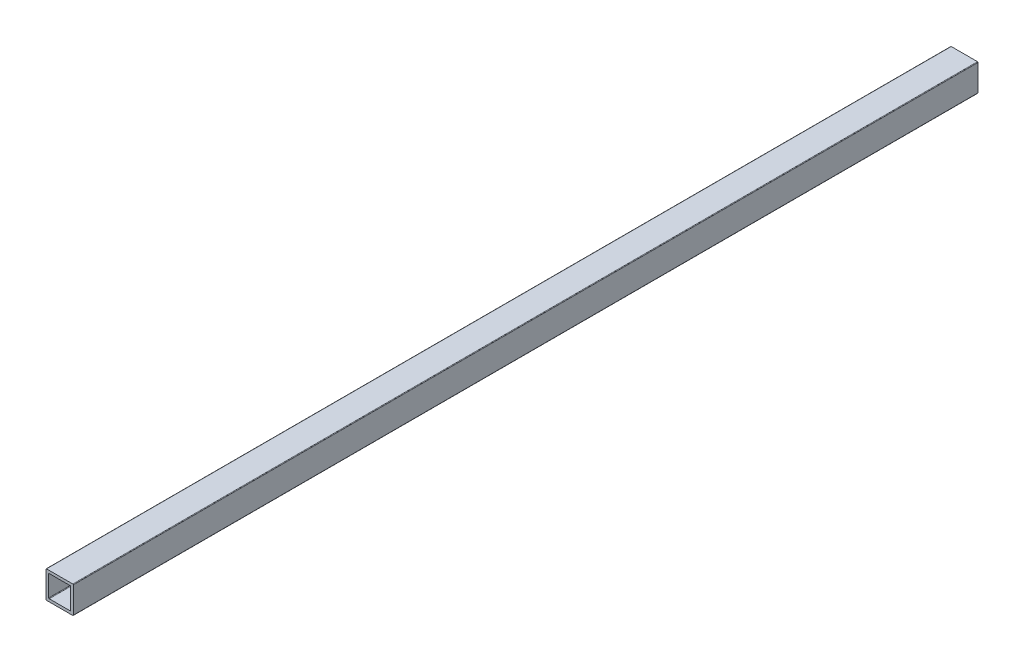
ISO-10303-21;
HEADER;
FILE_DESCRIPTION(('STEP AP214'),'2;1');
FILE_NAME('part.step','',(''),(''),'','','');
FILE_SCHEMA(('AUTOMOTIVE_DESIGN { 1 0 10303 214 1 1 1 1 }'));
ENDSEC;
DATA;
#1=APPLICATION_CONTEXT('core data for automotive mechanical design processes');
#2=APPLICATION_PROTOCOL_DEFINITION('international standard','automotive_design',2000,#1);
#3=PRODUCT_CONTEXT('',#1,'mechanical');
#4=PRODUCT('Part','Part','',(#3));
#5=PRODUCT_RELATED_PRODUCT_CATEGORY('part','',(#4));
#6=PRODUCT_DEFINITION_FORMATION('','',#4);
#7=PRODUCT_DEFINITION_CONTEXT('part definition',#1,'design');
#8=PRODUCT_DEFINITION('design','',#6,#7);
#9=PRODUCT_DEFINITION_SHAPE('','',#8);
#10=(LENGTH_UNIT() NAMED_UNIT(*) SI_UNIT(.MILLI.,.METRE.));
#11=(NAMED_UNIT(*) PLANE_ANGLE_UNIT() SI_UNIT($,.RADIAN.));
#12=(NAMED_UNIT(*) SI_UNIT($,.STERADIAN.) SOLID_ANGLE_UNIT());
#13=UNCERTAINTY_MEASURE_WITH_UNIT(LENGTH_MEASURE(1.E-05),#10,'distance_accuracy_value','');
#14=(GEOMETRIC_REPRESENTATION_CONTEXT(3) GLOBAL_UNCERTAINTY_ASSIGNED_CONTEXT((#13)) GLOBAL_UNIT_ASSIGNED_CONTEXT((#10,
#11,#12)) REPRESENTATION_CONTEXT('',''));
#15=CARTESIAN_POINT('',(0.,0.,0.));
#16=DIRECTION('',(0.,0.,1.));
#17=DIRECTION('',(1.,0.,0.));
#18=AXIS2_PLACEMENT_3D('',#15,#16,#17);
#19=CARTESIAN_POINT('',(0.,0.,331.47));
#20=DIRECTION('',(0.,0.,1.));
#21=DIRECTION('',(1.,0.,0.));
#22=AXIS2_PLACEMENT_3D('',#19,#20,#21);
#23=PLANE('',#22);
#24=DIRECTION('',(0.,-1.,0.));
#25=VECTOR('',#24,1.);
#26=CARTESIAN_POINT('',(-5.,5.,331.47));
#27=LINE('',#26,#25);
#28=CARTESIAN_POINT('',(-5.,4.8,331.47));
#29=VERTEX_POINT('',#28);
#30=CARTESIAN_POINT('',(-5.,-4.8,331.47));
#31=VERTEX_POINT('',#30);
#32=EDGE_CURVE('E262',#29,#31,#27,.T.);
#33=ORIENTED_EDGE('',*,*,#32,.T.);
#34=CARTESIAN_POINT('',(-4.8,-4.8,331.47));
#35=DIRECTION('',(0.,0.,1.));
#36=DIRECTION('',(1.,0.,0.));
#37=AXIS2_PLACEMENT_3D('',#34,#35,#36);
#38=CIRCLE('',#37,0.2);
#39=CARTESIAN_POINT('',(-4.8,-5.,331.47));
#40=VERTEX_POINT('',#39);
#41=EDGE_CURVE('E212',#31,#40,#38,.T.);
#42=ORIENTED_EDGE('',*,*,#41,.T.);
#43=DIRECTION('',(1.,0.,0.));
#44=VECTOR('',#43,1.);
#45=CARTESIAN_POINT('',(-5.,-5.,331.47));
#46=LINE('',#45,#44);
#47=CARTESIAN_POINT('',(4.8,-5.,331.47));
#48=VERTEX_POINT('',#47);
#49=EDGE_CURVE('E265',#40,#48,#46,.T.);
#50=ORIENTED_EDGE('',*,*,#49,.T.);
#51=CARTESIAN_POINT('',(4.8,-4.8,331.47));
#52=DIRECTION('',(0.,0.,1.));
#53=DIRECTION('',(1.,0.,0.));
#54=AXIS2_PLACEMENT_3D('',#51,#52,#53);
#55=CIRCLE('',#54,0.2);
#56=CARTESIAN_POINT('',(5.,-4.8,331.47));
#57=VERTEX_POINT('',#56);
#58=EDGE_CURVE('E210',#48,#57,#55,.T.);
#59=ORIENTED_EDGE('',*,*,#58,.T.);
#60=DIRECTION('',(0.,1.,0.));
#61=VECTOR('',#60,1.);
#62=CARTESIAN_POINT('',(5.,5.,331.47));
#63=LINE('',#62,#61);
#64=CARTESIAN_POINT('',(5.,4.8,331.47));
#65=VERTEX_POINT('',#64);
#66=EDGE_CURVE('E173',#57,#65,#63,.T.);
#67=ORIENTED_EDGE('',*,*,#66,.T.);
#68=CARTESIAN_POINT('',(4.8,4.8,331.47));
#69=DIRECTION('',(0.,0.,1.));
#70=DIRECTION('',(1.,0.,0.));
#71=AXIS2_PLACEMENT_3D('',#68,#69,#70);
#72=CIRCLE('',#71,0.2);
#73=CARTESIAN_POINT('',(4.8,5.,331.47));
#74=VERTEX_POINT('',#73);
#75=EDGE_CURVE('E206',#65,#74,#72,.T.);
#76=ORIENTED_EDGE('',*,*,#75,.T.);
#77=DIRECTION('',(-1.,0.,0.));
#78=VECTOR('',#77,1.);
#79=CARTESIAN_POINT('',(-5.,5.,331.47));
#80=LINE('',#79,#78);
#81=CARTESIAN_POINT('',(-4.8,5.,331.47));
#82=VERTEX_POINT('',#81);
#83=EDGE_CURVE('E168',#74,#82,#80,.T.);
#84=ORIENTED_EDGE('',*,*,#83,.T.);
#85=CARTESIAN_POINT('',(-4.8,4.8,331.47));
#86=DIRECTION('',(0.,0.,1.));
#87=DIRECTION('',(1.,0.,0.));
#88=AXIS2_PLACEMENT_3D('',#85,#86,#87);
#89=CIRCLE('',#88,0.2);
#90=EDGE_CURVE('E208',#82,#29,#89,.T.);
#91=ORIENTED_EDGE('',*,*,#90,.T.);
#92=EDGE_LOOP('',(#33,#42,#50,#59,#67,#76,#84,#91));
#93=FACE_BOUND('',#92,.T.);
#94=DIRECTION('',(1.,0.,0.));
#95=VECTOR('',#94,1.);
#96=CARTESIAN_POINT('',(-4.,-4.,331.47));
#97=LINE('',#96,#95);
#98=CARTESIAN_POINT('',(-3.8,-4.,331.47));
#99=VERTEX_POINT('',#98);
#100=CARTESIAN_POINT('',(3.8,-4.,331.47));
#101=VERTEX_POINT('',#100);
#102=EDGE_CURVE('E247',#99,#101,#97,.T.);
#103=ORIENTED_EDGE('',*,*,#102,.F.);
#104=CARTESIAN_POINT('',(-3.8,-3.8,331.47));
#105=DIRECTION('',(0.,0.,1.));
#106=DIRECTION('',(1.,0.,0.));
#107=AXIS2_PLACEMENT_3D('',#104,#105,#106);
#108=CIRCLE('',#107,0.2);
#109=CARTESIAN_POINT('',(-4.,-3.8,331.47));
#110=VERTEX_POINT('',#109);
#111=EDGE_CURVE('E11',#99,#110,#108,.F.);
#112=ORIENTED_EDGE('',*,*,#111,.T.);
#113=DIRECTION('',(0.,-1.,0.));
#114=VECTOR('',#113,1.);
#115=CARTESIAN_POINT('',(-4.,4.,331.47));
#116=LINE('',#115,#114);
#117=CARTESIAN_POINT('',(-4.,3.8,331.47));
#118=VERTEX_POINT('',#117);
#119=EDGE_CURVE('E245',#118,#110,#116,.T.);
#120=ORIENTED_EDGE('',*,*,#119,.F.);
#121=CARTESIAN_POINT('',(-3.8,3.8,331.47));
#122=DIRECTION('',(0.,0.,1.));
#123=DIRECTION('',(1.,0.,0.));
#124=AXIS2_PLACEMENT_3D('',#121,#122,#123);
#125=CIRCLE('',#124,0.2);
#126=CARTESIAN_POINT('',(-3.8,4.,331.47));
#127=VERTEX_POINT('',#126);
#128=EDGE_CURVE('E156',#118,#127,#125,.F.);
#129=ORIENTED_EDGE('',*,*,#128,.T.);
#130=DIRECTION('',(-1.,0.,0.));
#131=VECTOR('',#130,1.);
#132=CARTESIAN_POINT('',(-4.,4.,331.47));
#133=LINE('',#132,#131);
#134=CARTESIAN_POINT('',(3.8,4.,331.47));
#135=VERTEX_POINT('',#134);
#136=EDGE_CURVE('E257',#135,#127,#133,.T.);
#137=ORIENTED_EDGE('',*,*,#136,.F.);
#138=CARTESIAN_POINT('',(3.8,3.8,331.47));
#139=DIRECTION('',(0.,0.,1.));
#140=DIRECTION('',(1.,0.,0.));
#141=AXIS2_PLACEMENT_3D('',#138,#139,#140);
#142=CIRCLE('',#141,0.2);
#143=CARTESIAN_POINT('',(4.,3.8,331.47));
#144=VERTEX_POINT('',#143);
#145=EDGE_CURVE('E229',#135,#144,#142,.F.);
#146=ORIENTED_EDGE('',*,*,#145,.T.);
#147=DIRECTION('',(0.,1.,0.));
#148=VECTOR('',#147,1.);
#149=CARTESIAN_POINT('',(4.,4.,331.47));
#150=LINE('',#149,#148);
#151=CARTESIAN_POINT('',(4.,-3.8,331.47));
#152=VERTEX_POINT('',#151);
#153=EDGE_CURVE('E252',#152,#144,#150,.T.);
#154=ORIENTED_EDGE('',*,*,#153,.F.);
#155=CARTESIAN_POINT('',(3.8,-3.8,331.47));
#156=DIRECTION('',(0.,0.,1.));
#157=DIRECTION('',(1.,0.,0.));
#158=AXIS2_PLACEMENT_3D('',#155,#156,#157);
#159=CIRCLE('',#158,0.2);
#160=EDGE_CURVE('E47',#152,#101,#159,.F.);
#161=ORIENTED_EDGE('',*,*,#160,.T.);
#162=EDGE_LOOP('',(#103,#112,#120,#129,#137,#146,#154,#161));
#163=FACE_BOUND('',#162,.T.);
#164=ADVANCED_FACE('F32',(#93,#163),#23,.T.);
#165=CARTESIAN_POINT('',(0.,0.,0.));
#166=DIRECTION('',(0.,0.,1.));
#167=DIRECTION('',(1.,0.,0.));
#168=AXIS2_PLACEMENT_3D('',#165,#166,#167);
#169=PLANE('',#168);
#170=DIRECTION('',(1.,0.,0.));
#171=VECTOR('',#170,1.);
#172=CARTESIAN_POINT('',(-5.,-5.,0.));
#173=LINE('',#172,#171);
#174=CARTESIAN_POINT('',(-4.8,-5.,0.));
#175=VERTEX_POINT('',#174);
#176=CARTESIAN_POINT('',(4.8,-5.,0.));
#177=VERTEX_POINT('',#176);
#178=EDGE_CURVE('E272',#175,#177,#173,.T.);
#179=ORIENTED_EDGE('',*,*,#178,.F.);
#180=CARTESIAN_POINT('',(-4.8,-4.8,0.));
#181=DIRECTION('',(0.,0.,1.));
#182=DIRECTION('',(1.,0.,0.));
#183=AXIS2_PLACEMENT_3D('',#180,#181,#182);
#184=CIRCLE('',#183,0.2);
#185=CARTESIAN_POINT('',(-5.,-4.8,0.));
#186=VERTEX_POINT('',#185);
#187=EDGE_CURVE('E199',#175,#186,#184,.F.);
#188=ORIENTED_EDGE('',*,*,#187,.T.);
#189=DIRECTION('',(0.,-1.,0.));
#190=VECTOR('',#189,1.);
#191=CARTESIAN_POINT('',(-5.,5.,0.));
#192=LINE('',#191,#190);
#193=CARTESIAN_POINT('',(-5.,4.8,0.));
#194=VERTEX_POINT('',#193);
#195=EDGE_CURVE('E260',#194,#186,#192,.T.);
#196=ORIENTED_EDGE('',*,*,#195,.F.);
#197=CARTESIAN_POINT('',(-4.8,4.8,0.));
#198=DIRECTION('',(0.,0.,1.));
#199=DIRECTION('',(1.,0.,0.));
#200=AXIS2_PLACEMENT_3D('',#197,#198,#199);
#201=CIRCLE('',#200,0.2);
#202=CARTESIAN_POINT('',(-4.8,5.,0.));
#203=VERTEX_POINT('',#202);
#204=EDGE_CURVE('E195',#194,#203,#201,.F.);
#205=ORIENTED_EDGE('',*,*,#204,.T.);
#206=DIRECTION('',(-1.,0.,0.));
#207=VECTOR('',#206,1.);
#208=CARTESIAN_POINT('',(-5.,5.,0.));
#209=LINE('',#208,#207);
#210=CARTESIAN_POINT('',(4.8,5.,0.));
#211=VERTEX_POINT('',#210);
#212=EDGE_CURVE('E176',#211,#203,#209,.T.);
#213=ORIENTED_EDGE('',*,*,#212,.F.);
#214=CARTESIAN_POINT('',(4.8,4.8,0.));
#215=DIRECTION('',(0.,0.,1.));
#216=DIRECTION('',(1.,0.,0.));
#217=AXIS2_PLACEMENT_3D('',#214,#215,#216);
#218=CIRCLE('',#217,0.2);
#219=CARTESIAN_POINT('',(5.,4.8,0.));
#220=VERTEX_POINT('',#219);
#221=EDGE_CURVE('E193',#211,#220,#218,.F.);
#222=ORIENTED_EDGE('',*,*,#221,.T.);
#223=DIRECTION('',(0.,1.,0.));
#224=VECTOR('',#223,1.);
#225=CARTESIAN_POINT('',(5.,5.,0.));
#226=LINE('',#225,#224);
#227=CARTESIAN_POINT('',(5.,-4.8,0.));
#228=VERTEX_POINT('',#227);
#229=EDGE_CURVE('E274',#228,#220,#226,.T.);
#230=ORIENTED_EDGE('',*,*,#229,.F.);
#231=CARTESIAN_POINT('',(4.8,-4.8,0.));
#232=DIRECTION('',(0.,0.,1.));
#233=DIRECTION('',(1.,0.,0.));
#234=AXIS2_PLACEMENT_3D('',#231,#232,#233);
#235=CIRCLE('',#234,0.2);
#236=EDGE_CURVE('E197',#228,#177,#235,.F.);
#237=ORIENTED_EDGE('',*,*,#236,.T.);
#238=EDGE_LOOP('',(#179,#188,#196,#205,#213,#222,#230,#237));
#239=FACE_BOUND('',#238,.T.);
#240=DIRECTION('',(-1.,0.,0.));
#241=VECTOR('',#240,1.);
#242=CARTESIAN_POINT('',(-4.,4.,0.));
#243=LINE('',#242,#241);
#244=CARTESIAN_POINT('',(3.8,4.,0.));
#245=VERTEX_POINT('',#244);
#246=CARTESIAN_POINT('',(-3.8,4.,0.));
#247=VERTEX_POINT('',#246);
#248=EDGE_CURVE('E165',#245,#247,#243,.T.);
#249=ORIENTED_EDGE('',*,*,#248,.T.);
#250=CARTESIAN_POINT('',(-3.8,3.8,0.));
#251=DIRECTION('',(0.,0.,1.));
#252=DIRECTION('',(1.,0.,0.));
#253=AXIS2_PLACEMENT_3D('',#250,#251,#252);
#254=CIRCLE('',#253,0.2);
#255=CARTESIAN_POINT('',(-4.,3.8,0.));
#256=VERTEX_POINT('',#255);
#257=EDGE_CURVE('E231',#247,#256,#254,.T.);
#258=ORIENTED_EDGE('',*,*,#257,.T.);
#259=DIRECTION('',(0.,-1.,0.));
#260=VECTOR('',#259,1.);
#261=CARTESIAN_POINT('',(-4.,4.,0.));
#262=LINE('',#261,#260);
#263=CARTESIAN_POINT('',(-4.,-3.8,0.));
#264=VERTEX_POINT('',#263);
#265=EDGE_CURVE('E236',#256,#264,#262,.T.);
#266=ORIENTED_EDGE('',*,*,#265,.T.);
#267=CARTESIAN_POINT('',(-3.8,-3.8,0.));
#268=DIRECTION('',(0.,0.,1.));
#269=DIRECTION('',(1.,0.,0.));
#270=AXIS2_PLACEMENT_3D('',#267,#268,#269);
#271=CIRCLE('',#270,0.2);
#272=CARTESIAN_POINT('',(-3.8,-4.,0.));
#273=VERTEX_POINT('',#272);
#274=EDGE_CURVE('E40',#264,#273,#271,.T.);
#275=ORIENTED_EDGE('',*,*,#274,.T.);
#276=DIRECTION('',(1.,0.,0.));
#277=VECTOR('',#276,1.);
#278=CARTESIAN_POINT('',(-4.,-4.,0.));
#279=LINE('',#278,#277);
#280=CARTESIAN_POINT('',(3.8,-4.,0.));
#281=VERTEX_POINT('',#280);
#282=EDGE_CURVE('E151',#273,#281,#279,.T.);
#283=ORIENTED_EDGE('',*,*,#282,.T.);
#284=CARTESIAN_POINT('',(3.8,-3.8,0.));
#285=DIRECTION('',(0.,0.,1.));
#286=DIRECTION('',(1.,0.,0.));
#287=AXIS2_PLACEMENT_3D('',#284,#285,#286);
#288=CIRCLE('',#287,0.2);
#289=CARTESIAN_POINT('',(4.,-3.8,0.));
#290=VERTEX_POINT('',#289);
#291=EDGE_CURVE('E146',#281,#290,#288,.T.);
#292=ORIENTED_EDGE('',*,*,#291,.T.);
#293=DIRECTION('',(0.,1.,0.));
#294=VECTOR('',#293,1.);
#295=CARTESIAN_POINT('',(4.,4.,0.));
#296=LINE('',#295,#294);
#297=CARTESIAN_POINT('',(4.,3.8,0.));
#298=VERTEX_POINT('',#297);
#299=EDGE_CURVE('E150',#290,#298,#296,.T.);
#300=ORIENTED_EDGE('',*,*,#299,.T.);
#301=CARTESIAN_POINT('',(3.8,3.8,0.));
#302=DIRECTION('',(0.,0.,1.));
#303=DIRECTION('',(1.,0.,0.));
#304=AXIS2_PLACEMENT_3D('',#301,#302,#303);
#305=CIRCLE('',#304,0.2);
#306=EDGE_CURVE('E227',#298,#245,#305,.T.);
#307=ORIENTED_EDGE('',*,*,#306,.T.);
#308=EDGE_LOOP('',(#249,#258,#266,#275,#283,#292,#300,#307));
#309=FACE_BOUND('',#308,.T.);
#310=ADVANCED_FACE('F149',(#239,#309),#169,.F.);
#311=CARTESIAN_POINT('',(-5.,5.,331.47));
#312=DIRECTION('',(1.,0.,0.));
#313=DIRECTION('',(0.,1.,0.));
#314=AXIS2_PLACEMENT_3D('',#311,#312,#313);
#315=PLANE('',#314);
#316=ORIENTED_EDGE('',*,*,#195,.T.);
#317=DIRECTION('',(0.,0.,-1.));
#318=VECTOR('',#317,1.);
#319=CARTESIAN_POINT('',(-5.,-4.8,331.47));
#320=LINE('',#319,#318);
#321=EDGE_CURVE('E204',#186,#31,#320,.F.);
#322=ORIENTED_EDGE('',*,*,#321,.T.);
#323=ORIENTED_EDGE('',*,*,#32,.F.);
#324=DIRECTION('',(0.,0.,-1.));
#325=VECTOR('',#324,1.);
#326=CARTESIAN_POINT('',(-5.,4.8,331.47));
#327=LINE('',#326,#325);
#328=EDGE_CURVE('E201',#29,#194,#327,.T.);
#329=ORIENTED_EDGE('',*,*,#328,.T.);
#330=EDGE_LOOP('',(#316,#322,#323,#329));
#331=FACE_BOUND('',#330,.T.);
#332=ADVANCED_FACE('F295',(#331),#315,.F.);
#333=CARTESIAN_POINT('',(-5.,-5.,331.47));
#334=DIRECTION('',(0.,1.,0.));
#335=DIRECTION('',(-1.,0.,0.));
#336=AXIS2_PLACEMENT_3D('',#333,#334,#335);
#337=PLANE('',#336);
#338=ORIENTED_EDGE('',*,*,#49,.F.);
#339=DIRECTION('',(0.,0.,-1.));
#340=VECTOR('',#339,1.);
#341=CARTESIAN_POINT('',(-4.8,-5.,331.47));
#342=LINE('',#341,#340);
#343=EDGE_CURVE('E190',#40,#175,#342,.T.);
#344=ORIENTED_EDGE('',*,*,#343,.T.);
#345=ORIENTED_EDGE('',*,*,#178,.T.);
#346=DIRECTION('',(0.,0.,-1.));
#347=VECTOR('',#346,1.);
#348=CARTESIAN_POINT('',(4.8,-5.,331.47));
#349=LINE('',#348,#347);
#350=EDGE_CURVE('E188',#177,#48,#349,.F.);
#351=ORIENTED_EDGE('',*,*,#350,.T.);
#352=EDGE_LOOP('',(#338,#344,#345,#351));
#353=FACE_BOUND('',#352,.T.);
#354=ADVANCED_FACE('F304',(#353),#337,.F.);
#355=CARTESIAN_POINT('',(5.,5.,331.47));
#356=DIRECTION('',(-1.,0.,0.));
#357=DIRECTION('',(0.,-1.,0.));
#358=AXIS2_PLACEMENT_3D('',#355,#356,#357);
#359=PLANE('',#358);
#360=ORIENTED_EDGE('',*,*,#66,.F.);
#361=DIRECTION('',(0.,0.,-1.));
#362=VECTOR('',#361,1.);
#363=CARTESIAN_POINT('',(5.,-4.8,331.47));
#364=LINE('',#363,#362);
#365=EDGE_CURVE('E219',#57,#228,#364,.T.);
#366=ORIENTED_EDGE('',*,*,#365,.T.);
#367=ORIENTED_EDGE('',*,*,#229,.T.);
#368=DIRECTION('',(0.,0.,-1.));
#369=VECTOR('',#368,1.);
#370=CARTESIAN_POINT('',(5.,4.8,331.47));
#371=LINE('',#370,#369);
#372=EDGE_CURVE('E217',#220,#65,#371,.F.);
#373=ORIENTED_EDGE('',*,*,#372,.T.);
#374=EDGE_LOOP('',(#360,#366,#367,#373));
#375=FACE_BOUND('',#374,.T.);
#376=ADVANCED_FACE('F312',(#375),#359,.F.);
#377=CARTESIAN_POINT('',(-5.,5.,331.47));
#378=DIRECTION('',(0.,-1.,0.));
#379=DIRECTION('',(1.,0.,0.));
#380=AXIS2_PLACEMENT_3D('',#377,#378,#379);
#381=PLANE('',#380);
#382=ORIENTED_EDGE('',*,*,#212,.T.);
#383=DIRECTION('',(0.,0.,-1.));
#384=VECTOR('',#383,1.);
#385=CARTESIAN_POINT('',(-4.8,5.,331.47));
#386=LINE('',#385,#384);
#387=EDGE_CURVE('E225',#203,#82,#386,.F.);
#388=ORIENTED_EDGE('',*,*,#387,.T.);
#389=ORIENTED_EDGE('',*,*,#83,.F.);
#390=DIRECTION('',(0.,0.,-1.));
#391=VECTOR('',#390,1.);
#392=CARTESIAN_POINT('',(4.8,5.,331.47));
#393=LINE('',#392,#391);
#394=EDGE_CURVE('E222',#74,#211,#393,.T.);
#395=ORIENTED_EDGE('',*,*,#394,.T.);
#396=EDGE_LOOP('',(#382,#388,#389,#395));
#397=FACE_BOUND('',#396,.T.);
#398=ADVANCED_FACE('F283',(#397),#381,.F.);
#399=CARTESIAN_POINT('',(-4.,4.,331.47));
#400=DIRECTION('',(1.,0.,0.));
#401=DIRECTION('',(0.,1.,0.));
#402=AXIS2_PLACEMENT_3D('',#399,#400,#401);
#403=PLANE('',#402);
#404=ORIENTED_EDGE('',*,*,#265,.F.);
#405=DIRECTION('',(0.,0.,-1.));
#406=VECTOR('',#405,1.);
#407=CARTESIAN_POINT('',(-4.,3.8,331.47));
#408=LINE('',#407,#406);
#409=EDGE_CURVE('E186',#256,#118,#408,.F.);
#410=ORIENTED_EDGE('',*,*,#409,.T.);
#411=ORIENTED_EDGE('',*,*,#119,.T.);
#412=DIRECTION('',(0.,0.,-1.));
#413=VECTOR('',#412,1.);
#414=CARTESIAN_POINT('',(-4.,-3.8,0.));
#415=LINE('',#414,#413);
#416=EDGE_CURVE('E183',#110,#264,#415,.T.);
#417=ORIENTED_EDGE('',*,*,#416,.T.);
#418=EDGE_LOOP('',(#404,#410,#411,#417));
#419=FACE_BOUND('',#418,.T.);
#420=ADVANCED_FACE('F249',(#419),#403,.T.);
#421=CARTESIAN_POINT('',(-4.,-4.,331.47));
#422=DIRECTION('',(0.,1.,0.));
#423=DIRECTION('',(0.,0.,1.));
#424=AXIS2_PLACEMENT_3D('',#421,#422,#423);
#425=PLANE('',#424);
#426=ORIENTED_EDGE('',*,*,#102,.T.);
#427=DIRECTION('',(0.,0.,-1.));
#428=VECTOR('',#427,1.);
#429=CARTESIAN_POINT('',(3.8,-4.,0.));
#430=LINE('',#429,#428);
#431=EDGE_CURVE('E215',#101,#281,#430,.T.);
#432=ORIENTED_EDGE('',*,*,#431,.T.);
#433=ORIENTED_EDGE('',*,*,#282,.F.);
#434=DIRECTION('',(0.,0.,-1.));
#435=VECTOR('',#434,1.);
#436=CARTESIAN_POINT('',(-3.8,-4.,331.47));
#437=LINE('',#436,#435);
#438=EDGE_CURVE('E54',#273,#99,#437,.F.);
#439=ORIENTED_EDGE('',*,*,#438,.T.);
#440=EDGE_LOOP('',(#426,#432,#433,#439));
#441=FACE_BOUND('',#440,.T.);
#442=ADVANCED_FACE('F239',(#441),#425,.T.);
#443=CARTESIAN_POINT('',(4.,4.,331.47));
#444=DIRECTION('',(-1.,0.,0.));
#445=DIRECTION('',(0.,-1.,0.));
#446=AXIS2_PLACEMENT_3D('',#443,#444,#445);
#447=PLANE('',#446);
#448=ORIENTED_EDGE('',*,*,#153,.T.);
#449=DIRECTION('',(0.,0.,-1.));
#450=VECTOR('',#449,1.);
#451=CARTESIAN_POINT('',(4.,3.8,0.));
#452=LINE('',#451,#450);
#453=EDGE_CURVE('E164',#144,#298,#452,.T.);
#454=ORIENTED_EDGE('',*,*,#453,.T.);
#455=ORIENTED_EDGE('',*,*,#299,.F.);
#456=DIRECTION('',(0.,0.,-1.));
#457=VECTOR('',#456,1.);
#458=CARTESIAN_POINT('',(4.,-3.8,331.47));
#459=LINE('',#458,#457);
#460=EDGE_CURVE('E162',#290,#152,#459,.F.);
#461=ORIENTED_EDGE('',*,*,#460,.T.);
#462=EDGE_LOOP('',(#448,#454,#455,#461));
#463=FACE_BOUND('',#462,.T.);
#464=ADVANCED_FACE('F161',(#463),#447,.T.);
#465=CARTESIAN_POINT('',(-4.,4.,331.47));
#466=DIRECTION('',(0.,-1.,0.));
#467=DIRECTION('',(0.,0.,-1.));
#468=AXIS2_PLACEMENT_3D('',#465,#466,#467);
#469=PLANE('',#468);
#470=ORIENTED_EDGE('',*,*,#248,.F.);
#471=DIRECTION('',(0.,0.,-1.));
#472=VECTOR('',#471,1.);
#473=CARTESIAN_POINT('',(3.8,4.,331.47));
#474=LINE('',#473,#472);
#475=EDGE_CURVE('E181',#245,#135,#474,.F.);
#476=ORIENTED_EDGE('',*,*,#475,.T.);
#477=ORIENTED_EDGE('',*,*,#136,.T.);
#478=DIRECTION('',(0.,0.,-1.));
#479=VECTOR('',#478,1.);
#480=CARTESIAN_POINT('',(-3.8,4.,0.));
#481=LINE('',#480,#479);
#482=EDGE_CURVE('E170',#127,#247,#481,.T.);
#483=ORIENTED_EDGE('',*,*,#482,.T.);
#484=EDGE_LOOP('',(#470,#476,#477,#483));
#485=FACE_BOUND('',#484,.T.);
#486=ADVANCED_FACE('F334',(#485),#469,.T.);
#487=CARTESIAN_POINT('',(3.8,3.8,331.47));
#488=DIRECTION('',(0.,0.,1.));
#489=DIRECTION('',(1.,0.,0.));
#490=AXIS2_PLACEMENT_3D('',#487,#488,#489);
#491=CYLINDRICAL_SURFACE('',#490,0.2);
#492=ORIENTED_EDGE('',*,*,#145,.F.);
#493=ORIENTED_EDGE('',*,*,#475,.F.);
#494=ORIENTED_EDGE('',*,*,#306,.F.);
#495=ORIENTED_EDGE('',*,*,#453,.F.);
#496=EDGE_LOOP('',(#492,#493,#494,#495));
#497=FACE_BOUND('',#496,.T.);
#498=ADVANCED_FACE('F330',(#497),#491,.F.);
#499=CARTESIAN_POINT('',(-3.8,3.8,331.47));
#500=DIRECTION('',(0.,0.,1.));
#501=DIRECTION('',(1.,0.,0.));
#502=AXIS2_PLACEMENT_3D('',#499,#500,#501);
#503=CYLINDRICAL_SURFACE('',#502,0.2);
#504=ORIENTED_EDGE('',*,*,#128,.F.);
#505=ORIENTED_EDGE('',*,*,#409,.F.);
#506=ORIENTED_EDGE('',*,*,#257,.F.);
#507=ORIENTED_EDGE('',*,*,#482,.F.);
#508=EDGE_LOOP('',(#504,#505,#506,#507));
#509=FACE_BOUND('',#508,.T.);
#510=ADVANCED_FACE('F333',(#509),#503,.F.);
#511=CARTESIAN_POINT('',(-4.8,-4.8,331.47));
#512=DIRECTION('',(0.,0.,-1.));
#513=DIRECTION('',(-1.,0.,0.));
#514=AXIS2_PLACEMENT_3D('',#511,#512,#513);
#515=CYLINDRICAL_SURFACE('',#514,0.2);
#516=ORIENTED_EDGE('',*,*,#41,.F.);
#517=ORIENTED_EDGE('',*,*,#321,.F.);
#518=ORIENTED_EDGE('',*,*,#187,.F.);
#519=ORIENTED_EDGE('',*,*,#343,.F.);
#520=EDGE_LOOP('',(#516,#517,#518,#519));
#521=FACE_BOUND('',#520,.T.);
#522=ADVANCED_FACE('F299',(#521),#515,.T.);
#523=CARTESIAN_POINT('',(3.8,-3.8,331.47));
#524=DIRECTION('',(0.,0.,1.));
#525=DIRECTION('',(1.,0.,0.));
#526=AXIS2_PLACEMENT_3D('',#523,#524,#525);
#527=CYLINDRICAL_SURFACE('',#526,0.2);
#528=ORIENTED_EDGE('',*,*,#160,.F.);
#529=ORIENTED_EDGE('',*,*,#460,.F.);
#530=ORIENTED_EDGE('',*,*,#291,.F.);
#531=ORIENTED_EDGE('',*,*,#431,.F.);
#532=EDGE_LOOP('',(#528,#529,#530,#531));
#533=FACE_BOUND('',#532,.T.);
#534=ADVANCED_FACE('F167',(#533),#527,.F.);
#535=CARTESIAN_POINT('',(4.8,-4.8,331.47));
#536=DIRECTION('',(0.,0.,-1.));
#537=DIRECTION('',(-1.,0.,0.));
#538=AXIS2_PLACEMENT_3D('',#535,#536,#537);
#539=CYLINDRICAL_SURFACE('',#538,0.2);
#540=ORIENTED_EDGE('',*,*,#58,.F.);
#541=ORIENTED_EDGE('',*,*,#350,.F.);
#542=ORIENTED_EDGE('',*,*,#236,.F.);
#543=ORIENTED_EDGE('',*,*,#365,.F.);
#544=EDGE_LOOP('',(#540,#541,#542,#543));
#545=FACE_BOUND('',#544,.T.);
#546=ADVANCED_FACE('F308',(#545),#539,.T.);
#547=CARTESIAN_POINT('',(-4.8,4.8,331.47));
#548=DIRECTION('',(0.,0.,-1.));
#549=DIRECTION('',(-1.,0.,0.));
#550=AXIS2_PLACEMENT_3D('',#547,#548,#549);
#551=CYLINDRICAL_SURFACE('',#550,0.2);
#552=ORIENTED_EDGE('',*,*,#90,.F.);
#553=ORIENTED_EDGE('',*,*,#387,.F.);
#554=ORIENTED_EDGE('',*,*,#204,.F.);
#555=ORIENTED_EDGE('',*,*,#328,.F.);
#556=EDGE_LOOP('',(#552,#553,#554,#555));
#557=FACE_BOUND('',#556,.T.);
#558=ADVANCED_FACE('F289',(#557),#551,.T.);
#559=CARTESIAN_POINT('',(-3.8,-3.8,331.47));
#560=DIRECTION('',(0.,0.,1.));
#561=DIRECTION('',(1.,0.,0.));
#562=AXIS2_PLACEMENT_3D('',#559,#560,#561);
#563=CYLINDRICAL_SURFACE('',#562,0.2);
#564=ORIENTED_EDGE('',*,*,#111,.F.);
#565=ORIENTED_EDGE('',*,*,#438,.F.);
#566=ORIENTED_EDGE('',*,*,#274,.F.);
#567=ORIENTED_EDGE('',*,*,#416,.F.);
#568=EDGE_LOOP('',(#564,#565,#566,#567));
#569=FACE_BOUND('',#568,.T.);
#570=ADVANCED_FACE('F242',(#569),#563,.F.);
#571=CARTESIAN_POINT('',(4.8,4.8,331.47));
#572=DIRECTION('',(0.,0.,-1.));
#573=DIRECTION('',(-1.,0.,0.));
#574=AXIS2_PLACEMENT_3D('',#571,#572,#573);
#575=CYLINDRICAL_SURFACE('',#574,0.2);
#576=ORIENTED_EDGE('',*,*,#75,.F.);
#577=ORIENTED_EDGE('',*,*,#372,.F.);
#578=ORIENTED_EDGE('',*,*,#221,.F.);
#579=ORIENTED_EDGE('',*,*,#394,.F.);
#580=EDGE_LOOP('',(#576,#577,#578,#579));
#581=FACE_BOUND('',#580,.T.);
#582=ADVANCED_FACE('F34',(#581),#575,.T.);
#583=CLOSED_SHELL('',(#164,#310,#332,#354,#376,#398,#420,#442,#464,#486,#498,#510,#522,#534,
#546,#558,#570,#582));
#584=MANIFOLD_SOLID_BREP('B2',#583);
#585=ADVANCED_BREP_SHAPE_REPRESENTATION('',(#18,#584),#14);
#586=SHAPE_DEFINITION_REPRESENTATION(#9,#585);
ENDSEC;
END-ISO-10303-21;
